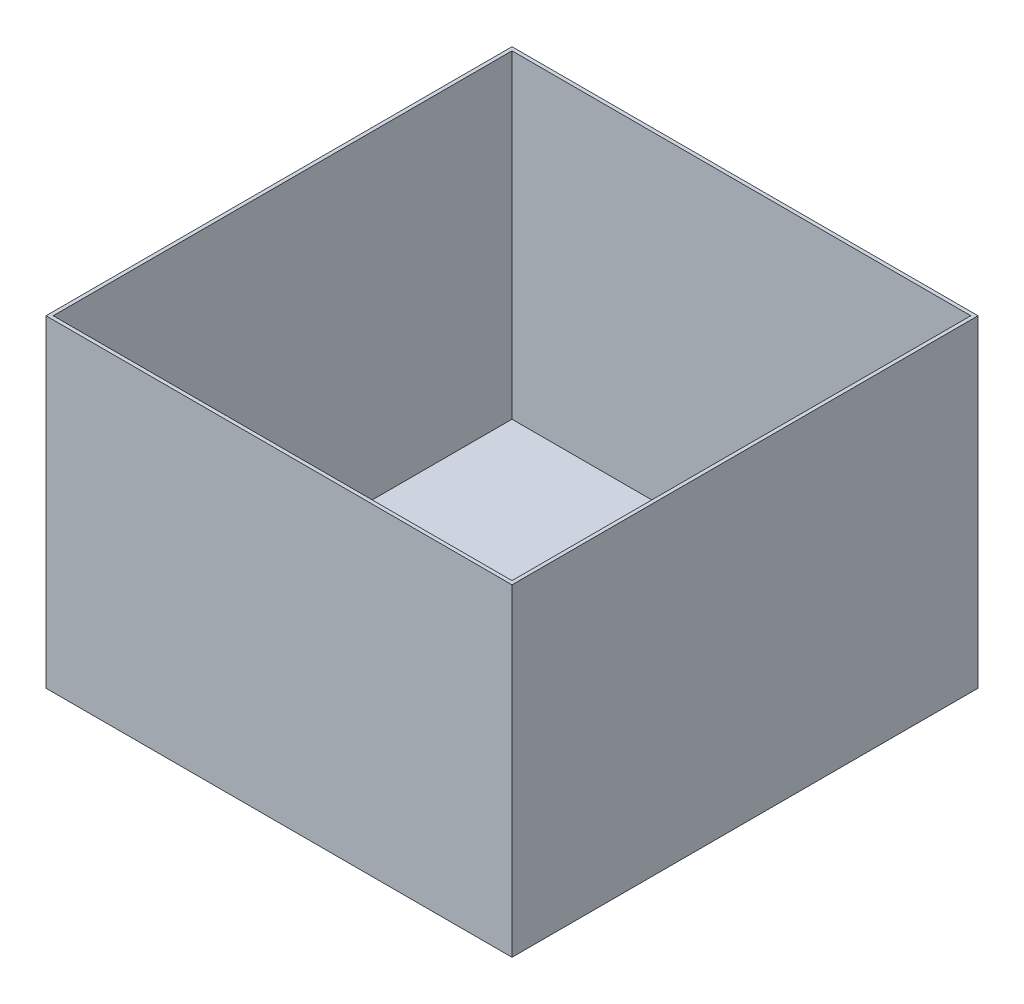
ISO-10303-21;
HEADER;
FILE_DESCRIPTION(('STEP AP214'),'2;1');
FILE_NAME('part.step','',(''),(''),'','','');
FILE_SCHEMA(('AUTOMOTIVE_DESIGN { 1 0 10303 214 1 1 1 1 }'));
ENDSEC;
DATA;
#1=APPLICATION_CONTEXT('core data for automotive mechanical design processes');
#2=APPLICATION_PROTOCOL_DEFINITION('international standard','automotive_design',2000,#1);
#3=PRODUCT_CONTEXT('',#1,'mechanical');
#4=PRODUCT('Part','Part','',(#3));
#5=PRODUCT_RELATED_PRODUCT_CATEGORY('part','',(#4));
#6=PRODUCT_DEFINITION_FORMATION('','',#4);
#7=PRODUCT_DEFINITION_CONTEXT('part definition',#1,'design');
#8=PRODUCT_DEFINITION('design','',#6,#7);
#9=PRODUCT_DEFINITION_SHAPE('','',#8);
#10=(LENGTH_UNIT() NAMED_UNIT(*) SI_UNIT(.MILLI.,.METRE.));
#11=(NAMED_UNIT(*) PLANE_ANGLE_UNIT() SI_UNIT($,.RADIAN.));
#12=(NAMED_UNIT(*) SI_UNIT($,.STERADIAN.) SOLID_ANGLE_UNIT());
#13=UNCERTAINTY_MEASURE_WITH_UNIT(LENGTH_MEASURE(1.E-05),#10,'distance_accuracy_value','');
#14=(GEOMETRIC_REPRESENTATION_CONTEXT(3) GLOBAL_UNCERTAINTY_ASSIGNED_CONTEXT((#13)) GLOBAL_UNIT_ASSIGNED_CONTEXT((#10,
#11,#12)) REPRESENTATION_CONTEXT('',''));
#15=CARTESIAN_POINT('',(0.,0.,0.));
#16=DIRECTION('',(0.,0.,1.));
#17=DIRECTION('',(1.,0.,0.));
#18=AXIS2_PLACEMENT_3D('',#15,#16,#17);
#19=CARTESIAN_POINT('',(-130.,2.,130.));
#20=DIRECTION('',(0.,0.,-1.));
#21=DIRECTION('',(-1.,0.,0.));
#22=AXIS2_PLACEMENT_3D('',#19,#20,#21);
#23=PLANE('',#22);
#24=DIRECTION('',(1.,0.,0.));
#25=VECTOR('',#24,1.);
#26=CARTESIAN_POINT('',(-130.,0.,130.));
#27=LINE('',#26,#25);
#28=CARTESIAN_POINT('',(-130.,0.,130.));
#29=VERTEX_POINT('',#28);
#30=CARTESIAN_POINT('',(130.,0.,130.));
#31=VERTEX_POINT('',#30);
#32=EDGE_CURVE('E172',#29,#31,#27,.T.);
#33=ORIENTED_EDGE('',*,*,#32,.T.);
#34=DIRECTION('',(0.,-1.,0.));
#35=VECTOR('',#34,1.);
#36=CARTESIAN_POINT('',(130.,2.,130.));
#37=LINE('',#36,#35);
#38=CARTESIAN_POINT('',(130.,180.,130.));
#39=VERTEX_POINT('',#38);
#40=EDGE_CURVE('E12',#39,#31,#37,.T.);
#41=ORIENTED_EDGE('',*,*,#40,.F.);
#42=DIRECTION('',(1.,0.,0.));
#43=VECTOR('',#42,1.);
#44=CARTESIAN_POINT('',(-130.,180.,130.));
#45=LINE('',#44,#43);
#46=CARTESIAN_POINT('',(-130.,180.,130.));
#47=VERTEX_POINT('',#46);
#48=EDGE_CURVE('E156',#47,#39,#45,.T.);
#49=ORIENTED_EDGE('',*,*,#48,.F.);
#50=DIRECTION('',(0.,-1.,0.));
#51=VECTOR('',#50,1.);
#52=CARTESIAN_POINT('',(-130.,2.,130.));
#53=LINE('',#52,#51);
#54=EDGE_CURVE('E184',#47,#29,#53,.T.);
#55=ORIENTED_EDGE('',*,*,#54,.T.);
#56=EDGE_LOOP('',(#33,#41,#49,#55));
#57=FACE_BOUND('',#56,.T.);
#58=ADVANCED_FACE('F59',(#57),#23,.F.);
#59=CARTESIAN_POINT('',(130.,2.,130.));
#60=DIRECTION('',(-1.,0.,0.));
#61=DIRECTION('',(0.,0.,1.));
#62=AXIS2_PLACEMENT_3D('',#59,#60,#61);
#63=PLANE('',#62);
#64=DIRECTION('',(0.,0.,-1.));
#65=VECTOR('',#64,1.);
#66=CARTESIAN_POINT('',(130.,0.,130.));
#67=LINE('',#66,#65);
#68=CARTESIAN_POINT('',(130.,0.,-130.));
#69=VERTEX_POINT('',#68);
#70=EDGE_CURVE('E175',#31,#69,#67,.T.);
#71=ORIENTED_EDGE('',*,*,#70,.T.);
#72=DIRECTION('',(0.,-1.,0.));
#73=VECTOR('',#72,1.);
#74=CARTESIAN_POINT('',(130.,2.,-130.));
#75=LINE('',#74,#73);
#76=CARTESIAN_POINT('',(130.,180.,-130.));
#77=VERTEX_POINT('',#76);
#78=EDGE_CURVE('E66',#77,#69,#75,.T.);
#79=ORIENTED_EDGE('',*,*,#78,.F.);
#80=DIRECTION('',(0.,0.,-1.));
#81=VECTOR('',#80,1.);
#82=CARTESIAN_POINT('',(130.,180.,130.));
#83=LINE('',#82,#81);
#84=EDGE_CURVE('E159',#39,#77,#83,.T.);
#85=ORIENTED_EDGE('',*,*,#84,.F.);
#86=ORIENTED_EDGE('',*,*,#40,.T.);
#87=EDGE_LOOP('',(#71,#79,#85,#86));
#88=FACE_BOUND('',#87,.T.);
#89=ADVANCED_FACE('F193',(#88),#63,.F.);
#90=CARTESIAN_POINT('',(-130.,2.,-130.));
#91=DIRECTION('',(0.,0.,-1.));
#92=DIRECTION('',(-1.,0.,0.));
#93=AXIS2_PLACEMENT_3D('',#90,#91,#92);
#94=PLANE('',#93);
#95=DIRECTION('',(1.,0.,0.));
#96=VECTOR('',#95,1.);
#97=CARTESIAN_POINT('',(-130.,0.,-130.));
#98=LINE('',#97,#96);
#99=CARTESIAN_POINT('',(-130.,0.,-130.));
#100=VERTEX_POINT('',#99);
#101=EDGE_CURVE('E178',#100,#69,#98,.T.);
#102=ORIENTED_EDGE('',*,*,#101,.F.);
#103=DIRECTION('',(0.,-1.,0.));
#104=VECTOR('',#103,1.);
#105=CARTESIAN_POINT('',(-130.,2.,-130.));
#106=LINE('',#105,#104);
#107=CARTESIAN_POINT('',(-130.,180.,-130.));
#108=VERTEX_POINT('',#107);
#109=EDGE_CURVE('E186',#108,#100,#106,.T.);
#110=ORIENTED_EDGE('',*,*,#109,.F.);
#111=DIRECTION('',(-1.,0.,0.));
#112=VECTOR('',#111,1.);
#113=CARTESIAN_POINT('',(-130.,180.,-130.));
#114=LINE('',#113,#112);
#115=EDGE_CURVE('E162',#77,#108,#114,.T.);
#116=ORIENTED_EDGE('',*,*,#115,.F.);
#117=ORIENTED_EDGE('',*,*,#78,.T.);
#118=EDGE_LOOP('',(#102,#110,#116,#117));
#119=FACE_BOUND('',#118,.T.);
#120=ADVANCED_FACE('F190',(#119),#94,.T.);
#121=CARTESIAN_POINT('',(-130.,2.,130.));
#122=DIRECTION('',(-1.,0.,0.));
#123=DIRECTION('',(0.,0.,1.));
#124=AXIS2_PLACEMENT_3D('',#121,#122,#123);
#125=PLANE('',#124);
#126=DIRECTION('',(0.,0.,-1.));
#127=VECTOR('',#126,1.);
#128=CARTESIAN_POINT('',(-130.,0.,130.));
#129=LINE('',#128,#127);
#130=EDGE_CURVE('E181',#29,#100,#129,.T.);
#131=ORIENTED_EDGE('',*,*,#130,.F.);
#132=ORIENTED_EDGE('',*,*,#54,.F.);
#133=DIRECTION('',(0.,0.,1.));
#134=VECTOR('',#133,1.);
#135=CARTESIAN_POINT('',(-130.,180.,130.));
#136=LINE('',#135,#134);
#137=EDGE_CURVE('E137',#108,#47,#136,.T.);
#138=ORIENTED_EDGE('',*,*,#137,.F.);
#139=ORIENTED_EDGE('',*,*,#109,.T.);
#140=EDGE_LOOP('',(#131,#132,#138,#139));
#141=FACE_BOUND('',#140,.T.);
#142=ADVANCED_FACE('F199',(#141),#125,.T.);
#143=CARTESIAN_POINT('',(0.,0.,0.));
#144=DIRECTION('',(0.,1.,0.));
#145=DIRECTION('',(0.,0.,1.));
#146=AXIS2_PLACEMENT_3D('',#143,#144,#145);
#147=PLANE('',#146);
#148=ORIENTED_EDGE('',*,*,#32,.F.);
#149=ORIENTED_EDGE('',*,*,#130,.T.);
#150=ORIENTED_EDGE('',*,*,#101,.T.);
#151=ORIENTED_EDGE('',*,*,#70,.F.);
#152=EDGE_LOOP('',(#148,#149,#150,#151));
#153=FACE_BOUND('',#152,.T.);
#154=ADVANCED_FACE('F196',(#153),#147,.F.);
#155=CARTESIAN_POINT('',(0.,180.,0.));
#156=DIRECTION('',(0.,1.,0.));
#157=DIRECTION('',(0.,0.,1.));
#158=AXIS2_PLACEMENT_3D('',#155,#156,#157);
#159=PLANE('',#158);
#160=ORIENTED_EDGE('',*,*,#137,.T.);
#161=ORIENTED_EDGE('',*,*,#48,.T.);
#162=ORIENTED_EDGE('',*,*,#84,.T.);
#163=ORIENTED_EDGE('',*,*,#115,.T.);
#164=EDGE_LOOP('',(#160,#161,#162,#163));
#165=FACE_BOUND('',#164,.T.);
#166=DIRECTION('',(1.,0.,0.));
#167=VECTOR('',#166,1.);
#168=CARTESIAN_POINT('',(0.,180.,128.));
#169=LINE('',#168,#167);
#170=CARTESIAN_POINT('',(-128.,180.,128.));
#171=VERTEX_POINT('',#170);
#172=CARTESIAN_POINT('',(128.,180.,128.));
#173=VERTEX_POINT('',#172);
#174=EDGE_CURVE('E131',#171,#173,#169,.T.);
#175=ORIENTED_EDGE('',*,*,#174,.F.);
#176=DIRECTION('',(0.,0.,1.));
#177=VECTOR('',#176,1.);
#178=CARTESIAN_POINT('',(-128.,180.,0.));
#179=LINE('',#178,#177);
#180=CARTESIAN_POINT('',(-128.,180.,-128.));
#181=VERTEX_POINT('',#180);
#182=EDGE_CURVE('E122',#181,#171,#179,.T.);
#183=ORIENTED_EDGE('',*,*,#182,.F.);
#184=DIRECTION('',(-1.,0.,0.));
#185=VECTOR('',#184,1.);
#186=CARTESIAN_POINT('',(0.,180.,-128.));
#187=LINE('',#186,#185);
#188=CARTESIAN_POINT('',(128.,180.,-128.));
#189=VERTEX_POINT('',#188);
#190=EDGE_CURVE('E145',#189,#181,#187,.T.);
#191=ORIENTED_EDGE('',*,*,#190,.F.);
#192=DIRECTION('',(0.,0.,-1.));
#193=VECTOR('',#192,1.);
#194=CARTESIAN_POINT('',(128.,180.,0.));
#195=LINE('',#194,#193);
#196=EDGE_CURVE('E143',#173,#189,#195,.T.);
#197=ORIENTED_EDGE('',*,*,#196,.F.);
#198=EDGE_LOOP('',(#175,#183,#191,#197));
#199=FACE_BOUND('',#198,.T.);
#200=ADVANCED_FACE('F141',(#165,#199),#159,.T.);
#201=CARTESIAN_POINT('',(-128.,180.,0.));
#202=DIRECTION('',(1.,0.,0.));
#203=DIRECTION('',(0.,0.,-1.));
#204=AXIS2_PLACEMENT_3D('',#201,#202,#203);
#205=PLANE('',#204);
#206=DIRECTION('',(0.,-1.,0.));
#207=VECTOR('',#206,1.);
#208=CARTESIAN_POINT('',(-128.,180.,128.));
#209=LINE('',#208,#207);
#210=CARTESIAN_POINT('',(-128.,2.,128.));
#211=VERTEX_POINT('',#210);
#212=EDGE_CURVE('E125',#171,#211,#209,.T.);
#213=ORIENTED_EDGE('',*,*,#212,.T.);
#214=DIRECTION('',(0.,0.,-1.));
#215=VECTOR('',#214,1.);
#216=CARTESIAN_POINT('',(-128.,2.,0.));
#217=LINE('',#216,#215);
#218=CARTESIAN_POINT('',(-128.,2.,-128.));
#219=VERTEX_POINT('',#218);
#220=EDGE_CURVE('E73',#211,#219,#217,.T.);
#221=ORIENTED_EDGE('',*,*,#220,.T.);
#222=DIRECTION('',(0.,-1.,0.));
#223=VECTOR('',#222,1.);
#224=CARTESIAN_POINT('',(-128.,180.,-128.));
#225=LINE('',#224,#223);
#226=EDGE_CURVE('E127',#181,#219,#225,.T.);
#227=ORIENTED_EDGE('',*,*,#226,.F.);
#228=ORIENTED_EDGE('',*,*,#182,.T.);
#229=EDGE_LOOP('',(#213,#221,#227,#228));
#230=FACE_BOUND('',#229,.T.);
#231=ADVANCED_FACE('F124',(#230),#205,.T.);
#232=CARTESIAN_POINT('',(0.,180.,128.));
#233=DIRECTION('',(0.,0.,-1.));
#234=DIRECTION('',(-1.,0.,0.));
#235=AXIS2_PLACEMENT_3D('',#232,#233,#234);
#236=PLANE('',#235);
#237=DIRECTION('',(0.,-1.,0.));
#238=VECTOR('',#237,1.);
#239=CARTESIAN_POINT('',(128.,180.,128.));
#240=LINE('',#239,#238);
#241=CARTESIAN_POINT('',(128.,2.,128.));
#242=VERTEX_POINT('',#241);
#243=EDGE_CURVE('E138',#173,#242,#240,.T.);
#244=ORIENTED_EDGE('',*,*,#243,.T.);
#245=DIRECTION('',(-1.,0.,0.));
#246=VECTOR('',#245,1.);
#247=CARTESIAN_POINT('',(0.,2.,128.));
#248=LINE('',#247,#246);
#249=EDGE_CURVE('E77',#242,#211,#248,.T.);
#250=ORIENTED_EDGE('',*,*,#249,.T.);
#251=ORIENTED_EDGE('',*,*,#212,.F.);
#252=ORIENTED_EDGE('',*,*,#174,.T.);
#253=EDGE_LOOP('',(#244,#250,#251,#252));
#254=FACE_BOUND('',#253,.T.);
#255=ADVANCED_FACE('F135',(#254),#236,.T.);
#256=CARTESIAN_POINT('',(128.,180.,0.));
#257=DIRECTION('',(-1.,0.,0.));
#258=DIRECTION('',(0.,0.,1.));
#259=AXIS2_PLACEMENT_3D('',#256,#257,#258);
#260=PLANE('',#259);
#261=DIRECTION('',(0.,-1.,0.));
#262=VECTOR('',#261,1.);
#263=CARTESIAN_POINT('',(128.,180.,-128.));
#264=LINE('',#263,#262);
#265=CARTESIAN_POINT('',(128.,2.00000000000006,-128.));
#266=VERTEX_POINT('',#265);
#267=EDGE_CURVE('E150',#189,#266,#264,.T.);
#268=ORIENTED_EDGE('',*,*,#267,.T.);
#269=DIRECTION('',(0.,0.,1.));
#270=VECTOR('',#269,1.);
#271=CARTESIAN_POINT('',(128.,2.,0.));
#272=LINE('',#271,#270);
#273=EDGE_CURVE('E168',#266,#242,#272,.T.);
#274=ORIENTED_EDGE('',*,*,#273,.T.);
#275=ORIENTED_EDGE('',*,*,#243,.F.);
#276=ORIENTED_EDGE('',*,*,#196,.T.);
#277=EDGE_LOOP('',(#268,#274,#275,#276));
#278=FACE_BOUND('',#277,.T.);
#279=ADVANCED_FACE('F227',(#278),#260,.T.);
#280=CARTESIAN_POINT('',(0.,180.,-128.));
#281=DIRECTION('',(0.,0.,1.));
#282=DIRECTION('',(1.,0.,0.));
#283=AXIS2_PLACEMENT_3D('',#280,#281,#282);
#284=PLANE('',#283);
#285=ORIENTED_EDGE('',*,*,#226,.T.);
#286=DIRECTION('',(1.,0.,0.));
#287=VECTOR('',#286,1.);
#288=CARTESIAN_POINT('',(0.,2.,-128.));
#289=LINE('',#288,#287);
#290=EDGE_CURVE('E165',#219,#266,#289,.T.);
#291=ORIENTED_EDGE('',*,*,#290,.T.);
#292=ORIENTED_EDGE('',*,*,#267,.F.);
#293=ORIENTED_EDGE('',*,*,#190,.T.);
#294=EDGE_LOOP('',(#285,#291,#292,#293));
#295=FACE_BOUND('',#294,.T.);
#296=ADVANCED_FACE('F220',(#295),#284,.T.);
#297=CARTESIAN_POINT('',(0.,2.,0.));
#298=DIRECTION('',(0.,1.,0.));
#299=DIRECTION('',(0.,0.,1.));
#300=AXIS2_PLACEMENT_3D('',#297,#298,#299);
#301=PLANE('',#300);
#302=ORIENTED_EDGE('',*,*,#220,.F.);
#303=ORIENTED_EDGE('',*,*,#249,.F.);
#304=ORIENTED_EDGE('',*,*,#273,.F.);
#305=ORIENTED_EDGE('',*,*,#290,.F.);
#306=EDGE_LOOP('',(#302,#303,#304,#305));
#307=FACE_BOUND('',#306,.T.);
#308=ADVANCED_FACE('F217',(#307),#301,.T.);
#309=CLOSED_SHELL('',(#58,#89,#120,#142,#154,#200,#231,#255,#279,#296,#308));
#310=MANIFOLD_SOLID_BREP('B2',#309);
#311=ADVANCED_BREP_SHAPE_REPRESENTATION('',(#18,#310),#14);
#312=SHAPE_DEFINITION_REPRESENTATION(#9,#311);
ENDSEC;
END-ISO-10303-21;
